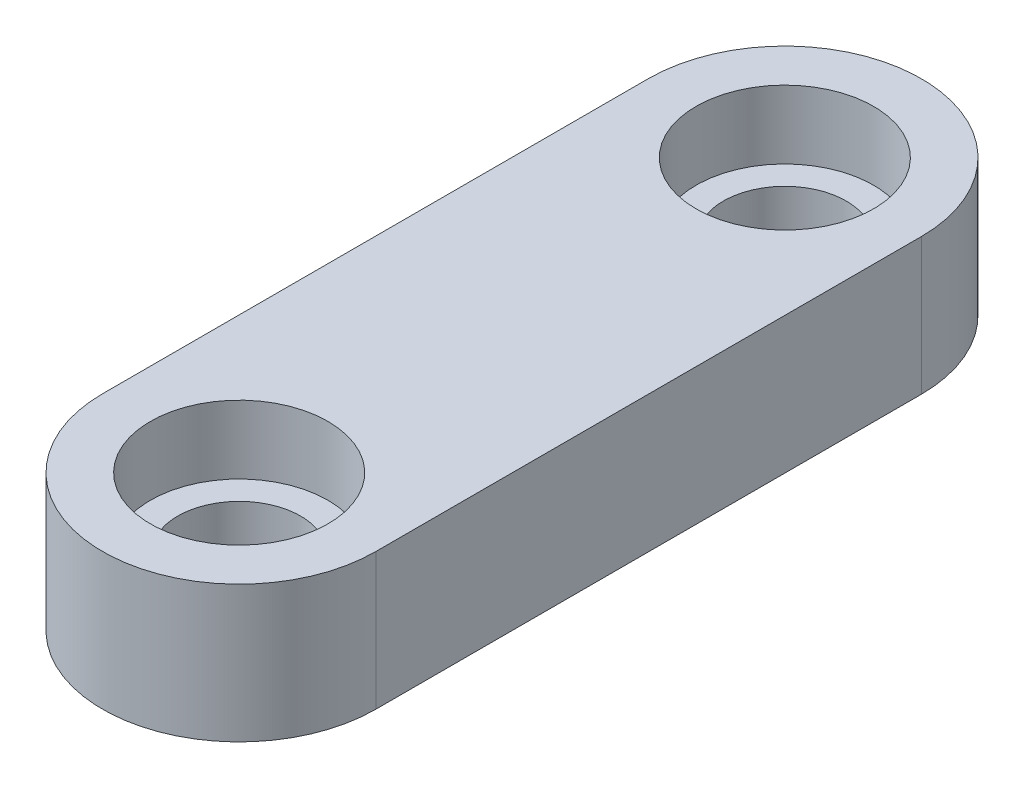
ISO-10303-21;
HEADER;
FILE_DESCRIPTION(('STEP AP214'),'2;1');
FILE_NAME('part.step','',(''),(''),'','','');
FILE_SCHEMA(('AUTOMOTIVE_DESIGN { 1 0 10303 214 1 1 1 1 }'));
ENDSEC;
DATA;
#1=APPLICATION_CONTEXT('core data for automotive mechanical design processes');
#2=APPLICATION_PROTOCOL_DEFINITION('international standard','automotive_design',2000,#1);
#3=PRODUCT_CONTEXT('',#1,'mechanical');
#4=PRODUCT('Part','Part','',(#3));
#5=PRODUCT_RELATED_PRODUCT_CATEGORY('part','',(#4));
#6=PRODUCT_DEFINITION_FORMATION('','',#4);
#7=PRODUCT_DEFINITION_CONTEXT('part definition',#1,'design');
#8=PRODUCT_DEFINITION('design','',#6,#7);
#9=PRODUCT_DEFINITION_SHAPE('','',#8);
#10=(LENGTH_UNIT() NAMED_UNIT(*) SI_UNIT(.MILLI.,.METRE.));
#11=(NAMED_UNIT(*) PLANE_ANGLE_UNIT() SI_UNIT($,.RADIAN.));
#12=(NAMED_UNIT(*) SI_UNIT($,.STERADIAN.) SOLID_ANGLE_UNIT());
#13=UNCERTAINTY_MEASURE_WITH_UNIT(LENGTH_MEASURE(1.E-05),#10,'distance_accuracy_value','');
#14=(GEOMETRIC_REPRESENTATION_CONTEXT(3) GLOBAL_UNCERTAINTY_ASSIGNED_CONTEXT((#13)) GLOBAL_UNIT_ASSIGNED_CONTEXT((#10,
#11,#12)) REPRESENTATION_CONTEXT('',''));
#15=CARTESIAN_POINT('',(0.,0.,0.));
#16=DIRECTION('',(0.,0.,1.));
#17=DIRECTION('',(1.,0.,0.));
#18=AXIS2_PLACEMENT_3D('',#15,#16,#17);
#19=CARTESIAN_POINT('',(-10.,-5.,59.9396097380543));
#20=DIRECTION('',(1.,0.,0.));
#21=DIRECTION('',(0.,0.,-1.));
#22=AXIS2_PLACEMENT_3D('',#19,#20,#21);
#23=PLANE('',#22);
#24=CARTESIAN_POINT('',(-10.,-1.,23.68932285491));
#25=DIRECTION('',(1.,0.,0.));
#26=DIRECTION('',(0.,0.,-1.));
#27=AXIS2_PLACEMENT_3D('',#24,#25,#26);
#28=CIRCLE('',#27,1.25);
#29=CARTESIAN_POINT('',(-10.,-1.,22.43932285491));
#30=VERTEX_POINT('',#29);
#31=EDGE_CURVE('E210',#30,#30,#28,.T.);
#32=ORIENTED_EDGE('',*,*,#31,.T.);
#33=EDGE_LOOP('',(#32));
#34=FACE_BOUND('',#33,.T.);
#35=CARTESIAN_POINT('',(-10.,-1.,27.8059310864469));
#36=DIRECTION('',(1.,0.,0.));
#37=DIRECTION('',(0.,0.,-1.));
#38=AXIS2_PLACEMENT_3D('',#35,#36,#37);
#39=CIRCLE('',#38,1.25);
#40=CARTESIAN_POINT('',(-10.,-1.,26.5559310864469));
#41=VERTEX_POINT('',#40);
#42=EDGE_CURVE('E637',#41,#41,#39,.T.);
#43=ORIENTED_EDGE('',*,*,#42,.T.);
#44=EDGE_LOOP('',(#43));
#45=FACE_BOUND('',#44,.T.);
#46=DIRECTION('',(0.,1.,0.));
#47=VECTOR('',#46,1.);
#48=CARTESIAN_POINT('',(-10.,-5.,49.9396097380543));
#49=LINE('',#48,#47);
#50=CARTESIAN_POINT('',(-10.,-5.,49.9396097380543));
#51=VERTEX_POINT('',#50);
#52=CARTESIAN_POINT('',(-10.,5.,49.9396097380543));
#53=VERTEX_POINT('',#52);
#54=EDGE_CURVE('E300',#51,#53,#49,.T.);
#55=ORIENTED_EDGE('',*,*,#54,.T.);
#56=DIRECTION('',(0.,0.,-1.));
#57=VECTOR('',#56,1.);
#58=CARTESIAN_POINT('',(-10.,5.,59.9396097380543));
#59=LINE('',#58,#57);
#60=CARTESIAN_POINT('',(-10.,5.,10.));
#61=VERTEX_POINT('',#60);
#62=EDGE_CURVE('E85',#53,#61,#59,.T.);
#63=ORIENTED_EDGE('',*,*,#62,.T.);
#64=DIRECTION('',(0.,1.,0.));
#65=VECTOR('',#64,1.);
#66=CARTESIAN_POINT('',(-10.,-5.,10.));
#67=LINE('',#66,#65);
#68=CARTESIAN_POINT('',(-10.,-5.,10.));
#69=VERTEX_POINT('',#68);
#70=EDGE_CURVE('E327',#69,#61,#67,.T.);
#71=ORIENTED_EDGE('',*,*,#70,.F.);
#72=DIRECTION('',(0.,0.,-1.));
#73=VECTOR('',#72,1.);
#74=CARTESIAN_POINT('',(-10.,-5.,59.9396097380543));
#75=LINE('',#74,#73);
#76=CARTESIAN_POINT('',(-10.,-5.,29.7476269706785));
#77=VERTEX_POINT('',#76);
#78=EDGE_CURVE('E350',#77,#69,#75,.T.);
#79=ORIENTED_EDGE('',*,*,#78,.F.);
#80=DIRECTION('',(0.,1.,0.));
#81=VECTOR('',#80,1.);
#82=CARTESIAN_POINT('',(-10.,-10.,29.7476269706785));
#83=LINE('',#82,#81);
#84=CARTESIAN_POINT('',(-10.,-10.,29.7476269706785));
#85=VERTEX_POINT('',#84);
#86=EDGE_CURVE('E286',#85,#77,#83,.T.);
#87=ORIENTED_EDGE('',*,*,#86,.F.);
#88=DIRECTION('',(0.,0.,1.));
#89=VECTOR('',#88,1.);
#90=CARTESIAN_POINT('',(-10.,-10.,33.7738022007449));
#91=LINE('',#90,#89);
#92=CARTESIAN_POINT('',(-10.,-10.,33.7738022007449));
#93=VERTEX_POINT('',#92);
#94=EDGE_CURVE('E238',#85,#93,#91,.T.);
#95=ORIENTED_EDGE('',*,*,#94,.T.);
#96=DIRECTION('',(0.,1.,0.));
#97=VECTOR('',#96,1.);
#98=CARTESIAN_POINT('',(-10.,-10.,33.7738022007449));
#99=LINE('',#98,#97);
#100=CARTESIAN_POINT('',(-10.,-5.,33.7738022007449));
#101=VERTEX_POINT('',#100);
#102=EDGE_CURVE('E283',#93,#101,#99,.T.);
#103=ORIENTED_EDGE('',*,*,#102,.T.);
#104=EDGE_CURVE('E351',#51,#101,#75,.T.);
#105=ORIENTED_EDGE('',*,*,#104,.F.);
#106=EDGE_LOOP('',(#55,#63,#71,#79,#87,#95,#103,#105));
#107=FACE_BOUND('',#106,.T.);
#108=ADVANCED_FACE('F75',(#34,#45,#107),#23,.F.);
#109=CARTESIAN_POINT('',(-10.,5.,59.9396097380543));
#110=DIRECTION('',(0.,-1.,0.));
#111=DIRECTION('',(0.,0.,-1.));
#112=AXIS2_PLACEMENT_3D('',#109,#110,#111);
#113=PLANE('',#112);
#114=CARTESIAN_POINT('',(0.,5.,49.9396097380543));
#115=DIRECTION('',(0.,-1.,0.));
#116=DIRECTION('',(0.,0.,-1.));
#117=AXIS2_PLACEMENT_3D('',#114,#115,#116);
#118=CIRCLE('',#117,6.5);
#119=CARTESIAN_POINT('',(0.,5.,43.4396097380543));
#120=VERTEX_POINT('',#119);
#121=EDGE_CURVE('E310',#120,#120,#118,.T.);
#122=ORIENTED_EDGE('',*,*,#121,.T.);
#123=EDGE_LOOP('',(#122));
#124=FACE_BOUND('',#123,.T.);
#125=CARTESIAN_POINT('',(0.,5.,10.));
#126=DIRECTION('',(0.,1.,0.));
#127=DIRECTION('',(0.,0.,1.));
#128=AXIS2_PLACEMENT_3D('',#125,#126,#127);
#129=CIRCLE('',#128,6.5);
#130=CARTESIAN_POINT('',(0.,5.,16.5));
#131=VERTEX_POINT('',#130);
#132=EDGE_CURVE('E339',#131,#131,#129,.T.);
#133=ORIENTED_EDGE('',*,*,#132,.F.);
#134=EDGE_LOOP('',(#133));
#135=FACE_BOUND('',#134,.T.);
#136=CARTESIAN_POINT('',(0.,5.,49.9396097380543));
#137=DIRECTION('',(0.,-1.,0.));
#138=DIRECTION('',(0.,0.,-1.));
#139=AXIS2_PLACEMENT_3D('',#136,#137,#138);
#140=CIRCLE('',#139,10.);
#141=CARTESIAN_POINT('',(10.,5.,49.9396097380543));
#142=VERTEX_POINT('',#141);
#143=EDGE_CURVE('E295',#142,#53,#140,.T.);
#144=ORIENTED_EDGE('',*,*,#143,.F.);
#145=DIRECTION('',(0.,0.,-1.));
#146=VECTOR('',#145,1.);
#147=CARTESIAN_POINT('',(10.,5.,59.9396097380543));
#148=LINE('',#147,#146);
#149=CARTESIAN_POINT('',(10.,5.,10.));
#150=VERTEX_POINT('',#149);
#151=EDGE_CURVE('E12',#142,#150,#148,.T.);
#152=ORIENTED_EDGE('',*,*,#151,.T.);
#153=CARTESIAN_POINT('',(0.,5.,10.));
#154=DIRECTION('',(0.,1.,0.));
#155=DIRECTION('',(0.,0.,1.));
#156=AXIS2_PLACEMENT_3D('',#153,#154,#155);
#157=CIRCLE('',#156,10.);
#158=EDGE_CURVE('E322',#150,#61,#157,.T.);
#159=ORIENTED_EDGE('',*,*,#158,.T.);
#160=ORIENTED_EDGE('',*,*,#62,.F.);
#161=EDGE_LOOP('',(#144,#152,#159,#160));
#162=FACE_BOUND('',#161,.T.);
#163=ADVANCED_FACE('F375',(#124,#135,#162),#113,.F.);
#164=CARTESIAN_POINT('',(-10.,-5.,59.9396097380543));
#165=DIRECTION('',(0.,1.,0.));
#166=DIRECTION('',(0.,0.,1.));
#167=AXIS2_PLACEMENT_3D('',#164,#165,#166);
#168=PLANE('',#167);
#169=CARTESIAN_POINT('',(0.,-5.,49.9396097380543));
#170=DIRECTION('',(0.,1.,0.));
#171=DIRECTION('',(0.,0.,1.));
#172=AXIS2_PLACEMENT_3D('',#169,#170,#171);
#173=CIRCLE('',#172,4.5);
#174=CARTESIAN_POINT('',(0.,-5.,54.4396097380543));
#175=VERTEX_POINT('',#174);
#176=EDGE_CURVE('E306',#175,#175,#173,.F.);
#177=ORIENTED_EDGE('',*,*,#176,.F.);
#178=EDGE_LOOP('',(#177));
#179=FACE_BOUND('',#178,.T.);
#180=CARTESIAN_POINT('',(0.,-5.,10.));
#181=DIRECTION('',(0.,1.,0.));
#182=DIRECTION('',(0.,0.,1.));
#183=AXIS2_PLACEMENT_3D('',#180,#181,#182);
#184=CIRCLE('',#183,4.5);
#185=CARTESIAN_POINT('',(0.,-5.,14.5));
#186=VERTEX_POINT('',#185);
#187=EDGE_CURVE('E335',#186,#186,#184,.T.);
#188=ORIENTED_EDGE('',*,*,#187,.T.);
#189=EDGE_LOOP('',(#188));
#190=FACE_BOUND('',#189,.T.);
#191=DIRECTION('',(1.,0.,0.));
#192=VECTOR('',#191,1.);
#193=CARTESIAN_POINT('',(-7.,-5.,21.7476269706784));
#194=LINE('',#193,#192);
#195=CARTESIAN_POINT('',(-7.,-5.,21.7476269706784));
#196=VERTEX_POINT('',#195);
#197=CARTESIAN_POINT('',(-3.8915716590061,-5.,21.7476269706784));
#198=VERTEX_POINT('',#197);
#199=EDGE_CURVE('E207',#196,#198,#194,.T.);
#200=ORIENTED_EDGE('',*,*,#199,.F.);
#201=DIRECTION('',(0.,0.,-1.));
#202=VECTOR('',#201,1.);
#203=CARTESIAN_POINT('',(-7.,-5.,29.7476269706784));
#204=LINE('',#203,#202);
#205=CARTESIAN_POINT('',(-7.,-5.,29.7476269706784));
#206=VERTEX_POINT('',#205);
#207=EDGE_CURVE('E185',#206,#196,#204,.T.);
#208=ORIENTED_EDGE('',*,*,#207,.F.);
#209=DIRECTION('',(-1.,0.,0.));
#210=VECTOR('',#209,1.);
#211=CARTESIAN_POINT('',(0.,-5.,29.7476269706784));
#212=LINE('',#211,#210);
#213=EDGE_CURVE('E257',#206,#77,#212,.T.);
#214=ORIENTED_EDGE('',*,*,#213,.T.);
#215=ORIENTED_EDGE('',*,*,#78,.T.);
#216=CARTESIAN_POINT('',(0.,-5.,10.));
#217=DIRECTION('',(0.,1.,0.));
#218=DIRECTION('',(0.,0.,1.));
#219=AXIS2_PLACEMENT_3D('',#216,#217,#218);
#220=CIRCLE('',#219,10.);
#221=CARTESIAN_POINT('',(10.,-5.,10.));
#222=VERTEX_POINT('',#221);
#223=EDGE_CURVE('E323',#222,#69,#220,.T.);
#224=ORIENTED_EDGE('',*,*,#223,.F.);
#225=DIRECTION('',(0.,0.,-1.));
#226=VECTOR('',#225,1.);
#227=CARTESIAN_POINT('',(10.,-5.,59.9396097380543));
#228=LINE('',#227,#226);
#229=CARTESIAN_POINT('',(10.,-5.,49.9396097380543));
#230=VERTEX_POINT('',#229);
#231=EDGE_CURVE('E344',#230,#222,#228,.T.);
#232=ORIENTED_EDGE('',*,*,#231,.F.);
#233=CARTESIAN_POINT('',(0.,-5.,49.9396097380543));
#234=DIRECTION('',(0.,-1.,0.));
#235=DIRECTION('',(0.,0.,-1.));
#236=AXIS2_PLACEMENT_3D('',#233,#234,#235);
#237=CIRCLE('',#236,10.);
#238=EDGE_CURVE('E296',#230,#51,#237,.T.);
#239=ORIENTED_EDGE('',*,*,#238,.T.);
#240=ORIENTED_EDGE('',*,*,#104,.T.);
#241=DIRECTION('',(0.86602540378444,0.,0.499999999999997));
#242=VECTOR('',#241,1.);
#243=CARTESIAN_POINT('',(-2.4754899132002,-5.,38.1180801248788));
#244=LINE('',#243,#242);
#245=CARTESIAN_POINT('',(-2.4754899132002,-5.,38.1180801248788));
#246=VERTEX_POINT('',#245);
#247=EDGE_CURVE('E262',#101,#246,#244,.T.);
#248=ORIENTED_EDGE('',*,*,#247,.T.);
#249=DIRECTION('',(0.,0.,-1.));
#250=VECTOR('',#249,1.);
#251=CARTESIAN_POINT('',(-2.47548991320016,-5.,33.8403871371327));
#252=LINE('',#251,#250);
#253=CARTESIAN_POINT('',(-2.47548991320016,-5.,33.8403871371327));
#254=VERTEX_POINT('',#253);
#255=EDGE_CURVE('E266',#246,#254,#252,.T.);
#256=ORIENTED_EDGE('',*,*,#255,.T.);
#257=DIRECTION('',(1.,0.,0.));
#258=VECTOR('',#257,1.);
#259=CARTESIAN_POINT('',(-2.47548991320016,-5.,33.8403871371327));
#260=LINE('',#259,#258);
#261=CARTESIAN_POINT('',(0.,-5.,33.8403871371327));
#262=VERTEX_POINT('',#261);
#263=EDGE_CURVE('E234',#254,#262,#260,.T.);
#264=ORIENTED_EDGE('',*,*,#263,.T.);
#265=DIRECTION('',(0.,0.,-1.));
#266=VECTOR('',#265,1.);
#267=CARTESIAN_POINT('',(0.,-5.,29.7476269706784));
#268=LINE('',#267,#266);
#269=CARTESIAN_POINT('',(0.,-5.,29.7476269706784));
#270=VERTEX_POINT('',#269);
#271=EDGE_CURVE('E101',#262,#270,#268,.T.);
#272=ORIENTED_EDGE('',*,*,#271,.T.);
#273=CARTESIAN_POINT('',(-3.8915716590061,-5.,29.7476269706784));
#274=VERTEX_POINT('',#273);
#275=EDGE_CURVE('E258',#270,#274,#212,.T.);
#276=ORIENTED_EDGE('',*,*,#275,.T.);
#277=DIRECTION('',(0.,0.,1.));
#278=VECTOR('',#277,1.);
#279=CARTESIAN_POINT('',(-3.8915716590061,-5.,29.7476269706784));
#280=LINE('',#279,#278);
#281=EDGE_CURVE('E93',#198,#274,#280,.T.);
#282=ORIENTED_EDGE('',*,*,#281,.F.);
#283=EDGE_LOOP('',(#200,#208,#214,#215,#224,#232,#239,#240,#248,#256,#264,#272,#276,#282));
#284=FACE_BOUND('',#283,.T.);
#285=ADVANCED_FACE('F378',(#179,#190,#284),#168,.F.);
#286=CARTESIAN_POINT('',(10.,-5.,59.9396097380543));
#287=DIRECTION('',(-1.,0.,0.));
#288=DIRECTION('',(0.,0.,1.));
#289=AXIS2_PLACEMENT_3D('',#286,#287,#288);
#290=PLANE('',#289);
#291=ORIENTED_EDGE('',*,*,#151,.F.);
#292=DIRECTION('',(0.,1.,0.));
#293=VECTOR('',#292,1.);
#294=CARTESIAN_POINT('',(10.,-5.,49.9396097380543));
#295=LINE('',#294,#293);
#296=EDGE_CURVE('E276',#230,#142,#295,.T.);
#297=ORIENTED_EDGE('',*,*,#296,.F.);
#298=ORIENTED_EDGE('',*,*,#231,.T.);
#299=DIRECTION('',(0.,1.,0.));
#300=VECTOR('',#299,1.);
#301=CARTESIAN_POINT('',(10.,-5.,10.));
#302=LINE('',#301,#300);
#303=EDGE_CURVE('E315',#222,#150,#302,.T.);
#304=ORIENTED_EDGE('',*,*,#303,.T.);
#305=EDGE_LOOP('',(#291,#297,#298,#304));
#306=FACE_BOUND('',#305,.T.);
#307=ADVANCED_FACE('F77',(#306),#290,.F.);
#308=CARTESIAN_POINT('',(0.,0.,10.));
#309=DIRECTION('',(0.,1.,0.));
#310=DIRECTION('',(0.,0.,1.));
#311=AXIS2_PLACEMENT_3D('',#308,#309,#310);
#312=CYLINDRICAL_SURFACE('',#311,6.5);
#313=CARTESIAN_POINT('',(0.,0.,10.));
#314=DIRECTION('',(0.,1.,0.));
#315=DIRECTION('',(0.,0.,1.));
#316=AXIS2_PLACEMENT_3D('',#313,#314,#315);
#317=CIRCLE('',#316,6.5);
#318=CARTESIAN_POINT('',(0.,0.,16.5));
#319=VERTEX_POINT('',#318);
#320=EDGE_CURVE('E340',#319,#319,#317,.T.);
#321=ORIENTED_EDGE('',*,*,#320,.F.);
#322=EDGE_LOOP('',(#321));
#323=FACE_BOUND('',#322,.T.);
#324=ORIENTED_EDGE('',*,*,#132,.T.);
#325=EDGE_LOOP('',(#324));
#326=FACE_BOUND('',#325,.T.);
#327=ADVANCED_FACE('F366',(#323,#326),#312,.F.);
#328=CARTESIAN_POINT('',(0.,0.,10.));
#329=DIRECTION('',(0.,1.,0.));
#330=DIRECTION('',(0.,0.,1.));
#331=AXIS2_PLACEMENT_3D('',#328,#329,#330);
#332=PLANE('',#331);
#333=CARTESIAN_POINT('',(0.,0.,10.));
#334=DIRECTION('',(0.,1.,0.));
#335=DIRECTION('',(0.,0.,1.));
#336=AXIS2_PLACEMENT_3D('',#333,#334,#335);
#337=CIRCLE('',#336,4.5);
#338=CARTESIAN_POINT('',(0.,0.,14.5));
#339=VERTEX_POINT('',#338);
#340=EDGE_CURVE('E334',#339,#339,#337,.T.);
#341=ORIENTED_EDGE('',*,*,#340,.F.);
#342=EDGE_LOOP('',(#341));
#343=FACE_BOUND('',#342,.T.);
#344=ORIENTED_EDGE('',*,*,#320,.T.);
#345=EDGE_LOOP('',(#344));
#346=FACE_BOUND('',#345,.T.);
#347=ADVANCED_FACE('F363',(#343,#346),#332,.T.);
#348=CARTESIAN_POINT('',(0.,-15.,10.));
#349=DIRECTION('',(0.,1.,0.));
#350=DIRECTION('',(0.,0.,1.));
#351=AXIS2_PLACEMENT_3D('',#348,#349,#350);
#352=CYLINDRICAL_SURFACE('',#351,4.5);
#353=ORIENTED_EDGE('',*,*,#340,.T.);
#354=EDGE_LOOP('',(#353));
#355=FACE_BOUND('',#354,.T.);
#356=ORIENTED_EDGE('',*,*,#187,.F.);
#357=EDGE_LOOP('',(#356));
#358=FACE_BOUND('',#357,.T.);
#359=ADVANCED_FACE('F360',(#355,#358),#352,.F.);
#360=CARTESIAN_POINT('',(0.,-5.,10.));
#361=DIRECTION('',(0.,1.,0.));
#362=DIRECTION('',(0.,0.,1.));
#363=AXIS2_PLACEMENT_3D('',#360,#361,#362);
#364=CYLINDRICAL_SURFACE('',#363,10.);
#365=ORIENTED_EDGE('',*,*,#158,.F.);
#366=ORIENTED_EDGE('',*,*,#303,.F.);
#367=ORIENTED_EDGE('',*,*,#223,.T.);
#368=ORIENTED_EDGE('',*,*,#70,.T.);
#369=EDGE_LOOP('',(#365,#366,#367,#368));
#370=FACE_BOUND('',#369,.T.);
#371=ADVANCED_FACE('F391',(#370),#364,.T.);
#372=CARTESIAN_POINT('',(0.,0.,49.9396097380543));
#373=DIRECTION('',(0.,1.,0.));
#374=DIRECTION('',(0.,0.,1.));
#375=AXIS2_PLACEMENT_3D('',#372,#373,#374);
#376=CYLINDRICAL_SURFACE('',#375,6.5);
#377=CARTESIAN_POINT('',(0.,0.,49.9396097380543));
#378=DIRECTION('',(0.,-1.,0.));
#379=DIRECTION('',(0.,0.,-1.));
#380=AXIS2_PLACEMENT_3D('',#377,#378,#379);
#381=CIRCLE('',#380,6.5);
#382=CARTESIAN_POINT('',(0.,0.,43.4396097380543));
#383=VERTEX_POINT('',#382);
#384=EDGE_CURVE('E311',#383,#383,#381,.T.);
#385=ORIENTED_EDGE('',*,*,#384,.T.);
#386=EDGE_LOOP('',(#385));
#387=FACE_BOUND('',#386,.T.);
#388=ORIENTED_EDGE('',*,*,#121,.F.);
#389=EDGE_LOOP('',(#388));
#390=FACE_BOUND('',#389,.T.);
#391=ADVANCED_FACE('F449',(#387,#390),#376,.F.);
#392=CARTESIAN_POINT('',(0.,0.,49.9396097380543));
#393=DIRECTION('',(0.,1.,0.));
#394=DIRECTION('',(0.,0.,-1.));
#395=AXIS2_PLACEMENT_3D('',#392,#393,#394);
#396=PLANE('',#395);
#397=CARTESIAN_POINT('',(0.,0.,49.9396097380543));
#398=DIRECTION('',(0.,1.,0.));
#399=DIRECTION('',(0.,0.,1.));
#400=AXIS2_PLACEMENT_3D('',#397,#398,#399);
#401=CIRCLE('',#400,4.5);
#402=CARTESIAN_POINT('',(0.,0.,54.4396097380543));
#403=VERTEX_POINT('',#402);
#404=EDGE_CURVE('E79',#403,#403,#401,.F.);
#405=ORIENTED_EDGE('',*,*,#404,.T.);
#406=EDGE_LOOP('',(#405));
#407=FACE_BOUND('',#406,.T.);
#408=ORIENTED_EDGE('',*,*,#384,.F.);
#409=EDGE_LOOP('',(#408));
#410=FACE_BOUND('',#409,.T.);
#411=ADVANCED_FACE('F452',(#407,#410),#396,.T.);
#412=CARTESIAN_POINT('',(0.,-15.,49.9396097380543));
#413=DIRECTION('',(0.,1.,0.));
#414=DIRECTION('',(0.,0.,1.));
#415=AXIS2_PLACEMENT_3D('',#412,#413,#414);
#416=CYLINDRICAL_SURFACE('',#415,4.5);
#417=ORIENTED_EDGE('',*,*,#404,.F.);
#418=EDGE_LOOP('',(#417));
#419=FACE_BOUND('',#418,.T.);
#420=ORIENTED_EDGE('',*,*,#176,.T.);
#421=EDGE_LOOP('',(#420));
#422=FACE_BOUND('',#421,.T.);
#423=ADVANCED_FACE('F456',(#419,#422),#416,.F.);
#424=CARTESIAN_POINT('',(0.,-5.,49.9396097380543));
#425=DIRECTION('',(0.,1.,0.));
#426=DIRECTION('',(0.,0.,1.));
#427=AXIS2_PLACEMENT_3D('',#424,#425,#426);
#428=CYLINDRICAL_SURFACE('',#427,10.);
#429=ORIENTED_EDGE('',*,*,#143,.T.);
#430=ORIENTED_EDGE('',*,*,#54,.F.);
#431=ORIENTED_EDGE('',*,*,#238,.F.);
#432=ORIENTED_EDGE('',*,*,#296,.T.);
#433=EDGE_LOOP('',(#429,#430,#431,#432));
#434=FACE_BOUND('',#433,.T.);
#435=ADVANCED_FACE('F385',(#434),#428,.T.);
#436=CARTESIAN_POINT('',(0.,-10.,29.7476269706784));
#437=DIRECTION('',(1.,0.,0.));
#438=DIRECTION('',(0.,0.,-1.));
#439=AXIS2_PLACEMENT_3D('',#436,#437,#438);
#440=PLANE('',#439);
#441=ORIENTED_EDGE('',*,*,#271,.F.);
#442=DIRECTION('',(0.,1.,0.));
#443=VECTOR('',#442,1.);
#444=CARTESIAN_POINT('',(0.,-10.,33.8403871371327));
#445=LINE('',#444,#443);
#446=CARTESIAN_POINT('',(0.,-10.,33.8403871371327));
#447=VERTEX_POINT('',#446);
#448=EDGE_CURVE('E273',#447,#262,#445,.T.);
#449=ORIENTED_EDGE('',*,*,#448,.F.);
#450=DIRECTION('',(0.,0.,-1.));
#451=VECTOR('',#450,1.);
#452=CARTESIAN_POINT('',(0.,-10.,29.7476269706784));
#453=LINE('',#452,#451);
#454=CARTESIAN_POINT('',(0.,-10.,29.7476269706784));
#455=VERTEX_POINT('',#454);
#456=EDGE_CURVE('E229',#447,#455,#453,.T.);
#457=ORIENTED_EDGE('',*,*,#456,.T.);
#458=DIRECTION('',(0.,1.,0.));
#459=VECTOR('',#458,1.);
#460=CARTESIAN_POINT('',(0.,-10.,29.7476269706784));
#461=LINE('',#460,#459);
#462=EDGE_CURVE('E254',#455,#270,#461,.T.);
#463=ORIENTED_EDGE('',*,*,#462,.T.);
#464=EDGE_LOOP('',(#441,#449,#457,#463));
#465=FACE_BOUND('',#464,.T.);
#466=ADVANCED_FACE('F420',(#465),#440,.T.);
#467=CARTESIAN_POINT('',(-2.47548991320016,-10.,33.8403871371327));
#468=DIRECTION('',(0.,0.,1.));
#469=DIRECTION('',(1.,0.,0.));
#470=AXIS2_PLACEMENT_3D('',#467,#468,#469);
#471=PLANE('',#470);
#472=ORIENTED_EDGE('',*,*,#263,.F.);
#473=DIRECTION('',(0.,1.,0.));
#474=VECTOR('',#473,1.);
#475=CARTESIAN_POINT('',(-2.47548991320016,-10.,33.8403871371327));
#476=LINE('',#475,#474);
#477=CARTESIAN_POINT('',(-2.47548991320016,-10.,33.8403871371327));
#478=VERTEX_POINT('',#477);
#479=EDGE_CURVE('E277',#478,#254,#476,.T.);
#480=ORIENTED_EDGE('',*,*,#479,.F.);
#481=DIRECTION('',(1.,0.,0.));
#482=VECTOR('',#481,1.);
#483=CARTESIAN_POINT('',(-2.47548991320016,-10.,33.8403871371327));
#484=LINE('',#483,#482);
#485=EDGE_CURVE('E250',#478,#447,#484,.T.);
#486=ORIENTED_EDGE('',*,*,#485,.T.);
#487=ORIENTED_EDGE('',*,*,#448,.T.);
#488=EDGE_LOOP('',(#472,#480,#486,#487));
#489=FACE_BOUND('',#488,.T.);
#490=ADVANCED_FACE('F419',(#489),#471,.T.);
#491=CARTESIAN_POINT('',(-2.47548991320016,-10.,33.8403871371327));
#492=DIRECTION('',(1.,0.,0.));
#493=DIRECTION('',(0.,0.,-1.));
#494=AXIS2_PLACEMENT_3D('',#491,#492,#493);
#495=PLANE('',#494);
#496=ORIENTED_EDGE('',*,*,#255,.F.);
#497=DIRECTION('',(0.,1.,0.));
#498=VECTOR('',#497,1.);
#499=CARTESIAN_POINT('',(-2.4754899132002,-10.,38.1180801248788));
#500=LINE('',#499,#498);
#501=CARTESIAN_POINT('',(-2.4754899132002,-10.,38.1180801248788));
#502=VERTEX_POINT('',#501);
#503=EDGE_CURVE('E280',#502,#246,#500,.T.);
#504=ORIENTED_EDGE('',*,*,#503,.F.);
#505=DIRECTION('',(0.,0.,-1.));
#506=VECTOR('',#505,1.);
#507=CARTESIAN_POINT('',(-2.47548991320016,-10.,33.8403871371327));
#508=LINE('',#507,#506);
#509=EDGE_CURVE('E246',#502,#478,#508,.T.);
#510=ORIENTED_EDGE('',*,*,#509,.T.);
#511=ORIENTED_EDGE('',*,*,#479,.T.);
#512=EDGE_LOOP('',(#496,#504,#510,#511));
#513=FACE_BOUND('',#512,.T.);
#514=ADVANCED_FACE('F417',(#513),#495,.T.);
#515=CARTESIAN_POINT('',(-2.4754899132002,-10.,38.1180801248788));
#516=DIRECTION('',(-0.499999999999998,0.,0.86602540378444));
#517=DIRECTION('',(0.86602540378444,0.,0.499999999999998));
#518=AXIS2_PLACEMENT_3D('',#515,#516,#517);
#519=PLANE('',#518);
#520=ORIENTED_EDGE('',*,*,#247,.F.);
#521=ORIENTED_EDGE('',*,*,#102,.F.);
#522=DIRECTION('',(0.86602540378444,0.,0.499999999999997));
#523=VECTOR('',#522,1.);
#524=CARTESIAN_POINT('',(-2.4754899132002,-10.,38.1180801248788));
#525=LINE('',#524,#523);
#526=EDGE_CURVE('E242',#93,#502,#525,.T.);
#527=ORIENTED_EDGE('',*,*,#526,.T.);
#528=ORIENTED_EDGE('',*,*,#503,.T.);
#529=EDGE_LOOP('',(#520,#521,#527,#528));
#530=FACE_BOUND('',#529,.T.);
#531=ADVANCED_FACE('F413',(#530),#519,.T.);
#532=CARTESIAN_POINT('',(0.,-10.,29.7476269706784));
#533=DIRECTION('',(0.,0.,-1.));
#534=DIRECTION('',(-1.,0.,0.));
#535=AXIS2_PLACEMENT_3D('',#532,#533,#534);
#536=PLANE('',#535);
#537=ORIENTED_EDGE('',*,*,#275,.F.);
#538=ORIENTED_EDGE('',*,*,#462,.F.);
#539=DIRECTION('',(-1.,0.,0.));
#540=VECTOR('',#539,1.);
#541=CARTESIAN_POINT('',(0.,-10.,29.7476269706784));
#542=LINE('',#541,#540);
#543=EDGE_CURVE('E233',#455,#85,#542,.T.);
#544=ORIENTED_EDGE('',*,*,#543,.T.);
#545=ORIENTED_EDGE('',*,*,#86,.T.);
#546=ORIENTED_EDGE('',*,*,#213,.F.);
#547=DIRECTION('',(0.,-1.,0.));
#548=VECTOR('',#547,1.);
#549=CARTESIAN_POINT('',(-7.,3.,29.7476269706784));
#550=LINE('',#549,#548);
#551=CARTESIAN_POINT('',(-7.,3.,29.7476269706784));
#552=VERTEX_POINT('',#551);
#553=EDGE_CURVE('E221',#552,#206,#550,.T.);
#554=ORIENTED_EDGE('',*,*,#553,.F.);
#555=DIRECTION('',(-1.,0.,0.));
#556=VECTOR('',#555,1.);
#557=CARTESIAN_POINT('',(-7.,3.,29.7476269706784));
#558=LINE('',#557,#556);
#559=CARTESIAN_POINT('',(-3.8915716590061,3.,29.7476269706784));
#560=VERTEX_POINT('',#559);
#561=EDGE_CURVE('E191',#560,#552,#558,.T.);
#562=ORIENTED_EDGE('',*,*,#561,.F.);
#563=DIRECTION('',(0.,-1.,0.));
#564=VECTOR('',#563,1.);
#565=CARTESIAN_POINT('',(-3.8915716590061,3.,29.7476269706784));
#566=LINE('',#565,#564);
#567=EDGE_CURVE('E224',#560,#274,#566,.T.);
#568=ORIENTED_EDGE('',*,*,#567,.T.);
#569=EDGE_LOOP('',(#537,#538,#544,#545,#546,#554,#562,#568));
#570=FACE_BOUND('',#569,.T.);
#571=ADVANCED_FACE('F402',(#570),#536,.T.);
#572=CARTESIAN_POINT('',(0.,-10.,0.));
#573=DIRECTION('',(0.,1.,0.));
#574=DIRECTION('',(0.,0.,1.));
#575=AXIS2_PLACEMENT_3D('',#572,#573,#574);
#576=PLANE('',#575);
#577=ORIENTED_EDGE('',*,*,#456,.F.);
#578=ORIENTED_EDGE('',*,*,#485,.F.);
#579=ORIENTED_EDGE('',*,*,#509,.F.);
#580=ORIENTED_EDGE('',*,*,#526,.F.);
#581=ORIENTED_EDGE('',*,*,#94,.F.);
#582=ORIENTED_EDGE('',*,*,#543,.F.);
#583=EDGE_LOOP('',(#577,#578,#579,#580,#581,#582));
#584=FACE_BOUND('',#583,.T.);
#585=ADVANCED_FACE('F408',(#584),#576,.F.);
#586=CARTESIAN_POINT('',(-7.,3.,29.7476269706784));
#587=DIRECTION('',(-1.,0.,0.));
#588=DIRECTION('',(0.,0.,1.));
#589=AXIS2_PLACEMENT_3D('',#586,#587,#588);
#590=PLANE('',#589);
#591=CARTESIAN_POINT('',(-7.,-1.,23.68932285491));
#592=DIRECTION('',(1.,0.,0.));
#593=DIRECTION('',(0.,0.,-1.));
#594=AXIS2_PLACEMENT_3D('',#591,#592,#593);
#595=CIRCLE('',#594,1.25);
#596=CARTESIAN_POINT('',(-7.,-1.,22.43932285491));
#597=VERTEX_POINT('',#596);
#598=EDGE_CURVE('E634',#597,#597,#595,.T.);
#599=ORIENTED_EDGE('',*,*,#598,.F.);
#600=EDGE_LOOP('',(#599));
#601=FACE_BOUND('',#600,.T.);
#602=CARTESIAN_POINT('',(-7.,-1.,27.8059310864469));
#603=DIRECTION('',(1.,0.,0.));
#604=DIRECTION('',(0.,0.,1.));
#605=AXIS2_PLACEMENT_3D('',#602,#603,#604);
#606=CIRCLE('',#605,1.25);
#607=CARTESIAN_POINT('',(-7.,-1.,29.0559310864469));
#608=VERTEX_POINT('',#607);
#609=EDGE_CURVE('E642',#608,#608,#606,.T.);
#610=ORIENTED_EDGE('',*,*,#609,.F.);
#611=EDGE_LOOP('',(#610));
#612=FACE_BOUND('',#611,.T.);
#613=ORIENTED_EDGE('',*,*,#207,.T.);
#614=DIRECTION('',(0.,-1.,0.));
#615=VECTOR('',#614,1.);
#616=CARTESIAN_POINT('',(-7.,3.,21.7476269706784));
#617=LINE('',#616,#615);
#618=CARTESIAN_POINT('',(-7.,3.,21.7476269706784));
#619=VERTEX_POINT('',#618);
#620=EDGE_CURVE('E178',#619,#196,#617,.T.);
#621=ORIENTED_EDGE('',*,*,#620,.F.);
#622=DIRECTION('',(0.,0.,-1.));
#623=VECTOR('',#622,1.);
#624=CARTESIAN_POINT('',(-7.,3.,29.7476269706784));
#625=LINE('',#624,#623);
#626=EDGE_CURVE('E182',#552,#619,#625,.T.);
#627=ORIENTED_EDGE('',*,*,#626,.F.);
#628=ORIENTED_EDGE('',*,*,#553,.T.);
#629=EDGE_LOOP('',(#613,#621,#627,#628));
#630=FACE_BOUND('',#629,.T.);
#631=ADVANCED_FACE('F180',(#601,#612,#630),#590,.F.);
#632=CARTESIAN_POINT('',(-3.8915716590061,3.,29.7476269706784));
#633=DIRECTION('',(1.,0.,0.));
#634=DIRECTION('',(0.,0.,-1.));
#635=AXIS2_PLACEMENT_3D('',#632,#633,#634);
#636=PLANE('',#635);
#637=ORIENTED_EDGE('',*,*,#281,.T.);
#638=ORIENTED_EDGE('',*,*,#567,.F.);
#639=DIRECTION('',(0.,0.,1.));
#640=VECTOR('',#639,1.);
#641=CARTESIAN_POINT('',(-3.8915716590061,3.,29.7476269706784));
#642=LINE('',#641,#640);
#643=CARTESIAN_POINT('',(-3.8915716590061,3.,21.7476269706784));
#644=VERTEX_POINT('',#643);
#645=EDGE_CURVE('E200',#644,#560,#642,.T.);
#646=ORIENTED_EDGE('',*,*,#645,.F.);
#647=DIRECTION('',(0.,-1.,0.));
#648=VECTOR('',#647,1.);
#649=CARTESIAN_POINT('',(-3.8915716590061,3.,21.7476269706784));
#650=LINE('',#649,#648);
#651=EDGE_CURVE('E190',#644,#198,#650,.T.);
#652=ORIENTED_EDGE('',*,*,#651,.T.);
#653=EDGE_LOOP('',(#637,#638,#646,#652));
#654=FACE_BOUND('',#653,.T.);
#655=ADVANCED_FACE('F421',(#654),#636,.F.);
#656=CARTESIAN_POINT('',(-7.,3.,21.7476269706784));
#657=DIRECTION('',(0.,0.,-1.));
#658=DIRECTION('',(-1.,0.,0.));
#659=AXIS2_PLACEMENT_3D('',#656,#657,#658);
#660=PLANE('',#659);
#661=ORIENTED_EDGE('',*,*,#199,.T.);
#662=ORIENTED_EDGE('',*,*,#651,.F.);
#663=DIRECTION('',(1.,0.,0.));
#664=VECTOR('',#663,1.);
#665=CARTESIAN_POINT('',(-7.,3.,21.7476269706784));
#666=LINE('',#665,#664);
#667=EDGE_CURVE('E194',#619,#644,#666,.T.);
#668=ORIENTED_EDGE('',*,*,#667,.F.);
#669=ORIENTED_EDGE('',*,*,#620,.T.);
#670=EDGE_LOOP('',(#661,#662,#668,#669));
#671=FACE_BOUND('',#670,.T.);
#672=ADVANCED_FACE('F195',(#671),#660,.F.);
#673=CARTESIAN_POINT('',(0.,3.,0.));
#674=DIRECTION('',(0.,-1.,0.));
#675=DIRECTION('',(0.,0.,-1.));
#676=AXIS2_PLACEMENT_3D('',#673,#674,#675);
#677=PLANE('',#676);
#678=ORIENTED_EDGE('',*,*,#626,.T.);
#679=ORIENTED_EDGE('',*,*,#667,.T.);
#680=ORIENTED_EDGE('',*,*,#645,.T.);
#681=ORIENTED_EDGE('',*,*,#561,.T.);
#682=EDGE_LOOP('',(#678,#679,#680,#681));
#683=FACE_BOUND('',#682,.T.);
#684=ADVANCED_FACE('F202',(#683),#677,.T.);
#685=CARTESIAN_POINT('',(-15.,-1.,27.8059310864469));
#686=DIRECTION('',(1.,0.,0.));
#687=DIRECTION('',(0.,0.,-1.));
#688=AXIS2_PLACEMENT_3D('',#685,#686,#687);
#689=CYLINDRICAL_SURFACE('',#688,1.25);
#690=ORIENTED_EDGE('',*,*,#609,.T.);
#691=EDGE_LOOP('',(#690));
#692=FACE_BOUND('',#691,.T.);
#693=ORIENTED_EDGE('',*,*,#42,.F.);
#694=EDGE_LOOP('',(#693));
#695=FACE_BOUND('',#694,.T.);
#696=ADVANCED_FACE('F491',(#692,#695),#689,.F.);
#697=CARTESIAN_POINT('',(-15.,-1.,23.68932285491));
#698=DIRECTION('',(1.,0.,0.));
#699=DIRECTION('',(0.,0.,-1.));
#700=AXIS2_PLACEMENT_3D('',#697,#698,#699);
#701=CYLINDRICAL_SURFACE('',#700,1.25);
#702=ORIENTED_EDGE('',*,*,#598,.T.);
#703=EDGE_LOOP('',(#702));
#704=FACE_BOUND('',#703,.T.);
#705=ORIENTED_EDGE('',*,*,#31,.F.);
#706=EDGE_LOOP('',(#705));
#707=FACE_BOUND('',#706,.T.);
#708=ADVANCED_FACE('F496',(#704,#707),#701,.F.);
#709=CLOSED_SHELL('',(#108,#163,#285,#307,#327,#347,#359,#371,#391,#411,#423,#435,#466,#490,
#514,#531,#571,#585,#631,#655,#672,#684,#696,#708));
#710=MANIFOLD_SOLID_BREP('B2',#709);
#711=ADVANCED_BREP_SHAPE_REPRESENTATION('',(#18,#710),#14);
#712=SHAPE_DEFINITION_REPRESENTATION(#9,#711);
ENDSEC;
END-ISO-10303-21;
